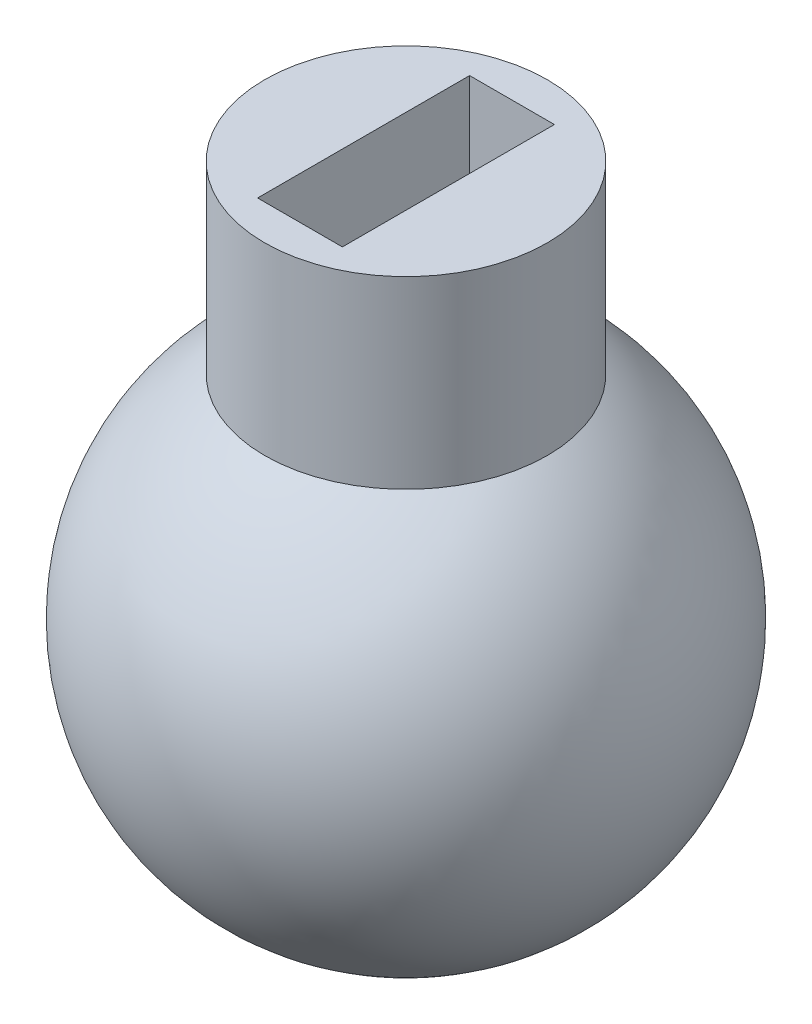
ISO-10303-21;
HEADER;
FILE_DESCRIPTION(('STEP AP214'),'2;1');
FILE_NAME('part.step','',(''),(''),'','','');
FILE_SCHEMA(('AUTOMOTIVE_DESIGN { 1 0 10303 214 1 1 1 1 }'));
ENDSEC;
DATA;
#1=APPLICATION_CONTEXT('core data for automotive mechanical design processes');
#2=APPLICATION_PROTOCOL_DEFINITION('international standard','automotive_design',2000,#1);
#3=PRODUCT_CONTEXT('',#1,'mechanical');
#4=PRODUCT('Part','Part','',(#3));
#5=PRODUCT_RELATED_PRODUCT_CATEGORY('part','',(#4));
#6=PRODUCT_DEFINITION_FORMATION('','',#4);
#7=PRODUCT_DEFINITION_CONTEXT('part definition',#1,'design');
#8=PRODUCT_DEFINITION('design','',#6,#7);
#9=PRODUCT_DEFINITION_SHAPE('','',#8);
#10=(LENGTH_UNIT() NAMED_UNIT(*) SI_UNIT(.MILLI.,.METRE.));
#11=(NAMED_UNIT(*) PLANE_ANGLE_UNIT() SI_UNIT($,.RADIAN.));
#12=(NAMED_UNIT(*) SI_UNIT($,.STERADIAN.) SOLID_ANGLE_UNIT());
#13=UNCERTAINTY_MEASURE_WITH_UNIT(LENGTH_MEASURE(1.E-05),#10,'distance_accuracy_value','');
#14=(GEOMETRIC_REPRESENTATION_CONTEXT(3) GLOBAL_UNCERTAINTY_ASSIGNED_CONTEXT((#13)) GLOBAL_UNIT_ASSIGNED_CONTEXT((#10,
#11,#12)) REPRESENTATION_CONTEXT('',''));
#15=CARTESIAN_POINT('',(0.,0.,0.));
#16=DIRECTION('',(0.,0.,1.));
#17=DIRECTION('',(1.,0.,0.));
#18=AXIS2_PLACEMENT_3D('',#15,#16,#17);
#19=CARTESIAN_POINT('',(-9.99999999999999,28.,0.));
#20=DIRECTION('',(0.,1.,0.));
#21=DIRECTION('',(0.,0.,1.));
#22=AXIS2_PLACEMENT_3D('',#19,#20,#21);
#23=PLANE('',#22);
#24=DIRECTION('',(0.,0.,-1.));
#25=VECTOR('',#24,1.);
#26=CARTESIAN_POINT('',(3.,28.,-7.5));
#27=LINE('',#26,#25);
#28=CARTESIAN_POINT('',(3.,28.,7.5));
#29=VERTEX_POINT('',#28);
#30=CARTESIAN_POINT('',(3.,28.,-7.5));
#31=VERTEX_POINT('',#30);
#32=EDGE_CURVE('E49',#29,#31,#27,.T.);
#33=ORIENTED_EDGE('',*,*,#32,.F.);
#34=DIRECTION('',(1.,0.,0.));
#35=VECTOR('',#34,1.);
#36=CARTESIAN_POINT('',(-3.,28.,7.5));
#37=LINE('',#36,#35);
#38=CARTESIAN_POINT('',(-3.,28.,7.5));
#39=VERTEX_POINT('',#38);
#40=EDGE_CURVE('E100',#39,#29,#37,.T.);
#41=ORIENTED_EDGE('',*,*,#40,.F.);
#42=DIRECTION('',(0.,0.,1.));
#43=VECTOR('',#42,1.);
#44=CARTESIAN_POINT('',(-3.,28.,-7.5));
#45=LINE('',#44,#43);
#46=CARTESIAN_POINT('',(-3.,28.,-7.5));
#47=VERTEX_POINT('',#46);
#48=EDGE_CURVE('E106',#47,#39,#45,.T.);
#49=ORIENTED_EDGE('',*,*,#48,.F.);
#50=DIRECTION('',(-1.,0.,0.));
#51=VECTOR('',#50,1.);
#52=CARTESIAN_POINT('',(-3.,28.,-7.5));
#53=LINE('',#52,#51);
#54=EDGE_CURVE('E84',#31,#47,#53,.T.);
#55=ORIENTED_EDGE('',*,*,#54,.F.);
#56=EDGE_LOOP('',(#33,#41,#49,#55));
#57=FACE_BOUND('',#56,.T.);
#58=CARTESIAN_POINT('',(0.,28.,0.));
#59=DIRECTION('',(0.,1.,0.));
#60=DIRECTION('',(0.,0.,1.));
#61=AXIS2_PLACEMENT_3D('',#58,#59,#60);
#62=CIRCLE('',#61,9.99999999999999);
#63=CARTESIAN_POINT('',(0.,28.,9.99999999999999));
#64=VERTEX_POINT('',#63);
#65=EDGE_CURVE('E11',#64,#64,#62,.T.);
#66=ORIENTED_EDGE('',*,*,#65,.T.);
#67=EDGE_LOOP('',(#66));
#68=FACE_BOUND('',#67,.T.);
#69=ADVANCED_FACE('F35',(#57,#68),#23,.T.);
#70=CARTESIAN_POINT('',(0.,81.2795464270371,0.));
#71=DIRECTION('',(0.,1.,0.));
#72=DIRECTION('',(0.,0.,1.));
#73=AXIS2_PLACEMENT_3D('',#70,#71,#72);
#74=CYLINDRICAL_SURFACE('',#73,9.99999999999999);
#75=CARTESIAN_POINT('',(0.,14.9666295470958,0.));
#76=DIRECTION('',(0.,1.,0.));
#77=DIRECTION('',(0.,0.,1.));
#78=AXIS2_PLACEMENT_3D('',#75,#76,#77);
#79=CIRCLE('',#78,9.99999999999999);
#80=CARTESIAN_POINT('',(0.,14.9666295470958,9.99999999999999));
#81=VERTEX_POINT('',#80);
#82=EDGE_CURVE('E42',#81,#81,#79,.T.);
#83=ORIENTED_EDGE('',*,*,#82,.T.);
#84=EDGE_LOOP('',(#83));
#85=FACE_BOUND('',#84,.T.);
#86=ORIENTED_EDGE('',*,*,#65,.F.);
#87=EDGE_LOOP('',(#86));
#88=FACE_BOUND('',#87,.T.);
#89=ADVANCED_FACE('F114',(#85,#88),#74,.T.);
#90=CARTESIAN_POINT('',(0.,0.,0.));
#91=DIRECTION('',(0.,1.,0.));
#92=DIRECTION('',(-1.,0.,0.));
#93=AXIS2_PLACEMENT_3D('',#90,#91,#92);
#94=SPHERICAL_SURFACE('',#93,18.);
#95=ORIENTED_EDGE('',*,*,#82,.F.);
#96=EDGE_LOOP('',(#95));
#97=FACE_BOUND('',#96,.T.);
#98=ADVANCED_FACE('F117',(#97),#94,.T.);
#99=CARTESIAN_POINT('',(3.,4.,-7.5));
#100=DIRECTION('',(1.,0.,0.));
#101=DIRECTION('',(0.,0.,-1.));
#102=AXIS2_PLACEMENT_3D('',#99,#100,#101);
#103=PLANE('',#102);
#104=ORIENTED_EDGE('',*,*,#32,.T.);
#105=DIRECTION('',(0.,1.,0.));
#106=VECTOR('',#105,1.);
#107=CARTESIAN_POINT('',(3.,4.,-7.5));
#108=LINE('',#107,#106);
#109=CARTESIAN_POINT('',(3.,4.,-7.5));
#110=VERTEX_POINT('',#109);
#111=EDGE_CURVE('E72',#110,#31,#108,.T.);
#112=ORIENTED_EDGE('',*,*,#111,.F.);
#113=DIRECTION('',(0.,0.,-1.));
#114=VECTOR('',#113,1.);
#115=CARTESIAN_POINT('',(3.,4.,-7.5));
#116=LINE('',#115,#114);
#117=CARTESIAN_POINT('',(3.,4.,7.5));
#118=VERTEX_POINT('',#117);
#119=EDGE_CURVE('E98',#118,#110,#116,.T.);
#120=ORIENTED_EDGE('',*,*,#119,.F.);
#121=DIRECTION('',(0.,1.,0.));
#122=VECTOR('',#121,1.);
#123=CARTESIAN_POINT('',(3.,4.,7.5));
#124=LINE('',#123,#122);
#125=EDGE_CURVE('E57',#118,#29,#124,.T.);
#126=ORIENTED_EDGE('',*,*,#125,.T.);
#127=EDGE_LOOP('',(#104,#112,#120,#126));
#128=FACE_BOUND('',#127,.T.);
#129=ADVANCED_FACE('F119',(#128),#103,.F.);
#130=CARTESIAN_POINT('',(-3.,4.,7.5));
#131=DIRECTION('',(0.,0.,1.));
#132=DIRECTION('',(1.,0.,0.));
#133=AXIS2_PLACEMENT_3D('',#130,#131,#132);
#134=PLANE('',#133);
#135=ORIENTED_EDGE('',*,*,#40,.T.);
#136=ORIENTED_EDGE('',*,*,#125,.F.);
#137=DIRECTION('',(1.,0.,0.));
#138=VECTOR('',#137,1.);
#139=CARTESIAN_POINT('',(-3.,4.,7.5));
#140=LINE('',#139,#138);
#141=CARTESIAN_POINT('',(-3.,4.,7.5));
#142=VERTEX_POINT('',#141);
#143=EDGE_CURVE('E95',#142,#118,#140,.T.);
#144=ORIENTED_EDGE('',*,*,#143,.F.);
#145=DIRECTION('',(0.,1.,0.));
#146=VECTOR('',#145,1.);
#147=CARTESIAN_POINT('',(-3.,4.,7.5));
#148=LINE('',#147,#146);
#149=EDGE_CURVE('E88',#142,#39,#148,.T.);
#150=ORIENTED_EDGE('',*,*,#149,.T.);
#151=EDGE_LOOP('',(#135,#136,#144,#150));
#152=FACE_BOUND('',#151,.T.);
#153=ADVANCED_FACE('F125',(#152),#134,.F.);
#154=CARTESIAN_POINT('',(-3.,4.,-7.5));
#155=DIRECTION('',(-1.,0.,0.));
#156=DIRECTION('',(0.,0.,1.));
#157=AXIS2_PLACEMENT_3D('',#154,#155,#156);
#158=PLANE('',#157);
#159=ORIENTED_EDGE('',*,*,#48,.T.);
#160=ORIENTED_EDGE('',*,*,#149,.F.);
#161=DIRECTION('',(0.,0.,1.));
#162=VECTOR('',#161,1.);
#163=CARTESIAN_POINT('',(-3.,4.,-7.5));
#164=LINE('',#163,#162);
#165=CARTESIAN_POINT('',(-3.,4.,-7.5));
#166=VERTEX_POINT('',#165);
#167=EDGE_CURVE('E91',#166,#142,#164,.T.);
#168=ORIENTED_EDGE('',*,*,#167,.F.);
#169=DIRECTION('',(0.,1.,0.));
#170=VECTOR('',#169,1.);
#171=CARTESIAN_POINT('',(-3.,4.,-7.5));
#172=LINE('',#171,#170);
#173=EDGE_CURVE('E77',#166,#47,#172,.T.);
#174=ORIENTED_EDGE('',*,*,#173,.T.);
#175=EDGE_LOOP('',(#159,#160,#168,#174));
#176=FACE_BOUND('',#175,.T.);
#177=ADVANCED_FACE('F92',(#176),#158,.F.);
#178=CARTESIAN_POINT('',(-3.,4.,-7.5));
#179=DIRECTION('',(0.,0.,-1.));
#180=DIRECTION('',(-1.,0.,0.));
#181=AXIS2_PLACEMENT_3D('',#178,#179,#180);
#182=PLANE('',#181);
#183=ORIENTED_EDGE('',*,*,#54,.T.);
#184=ORIENTED_EDGE('',*,*,#173,.F.);
#185=DIRECTION('',(-1.,0.,0.));
#186=VECTOR('',#185,1.);
#187=CARTESIAN_POINT('',(-3.,4.,-7.5));
#188=LINE('',#187,#186);
#189=EDGE_CURVE('E81',#110,#166,#188,.T.);
#190=ORIENTED_EDGE('',*,*,#189,.F.);
#191=ORIENTED_EDGE('',*,*,#111,.T.);
#192=EDGE_LOOP('',(#183,#184,#190,#191));
#193=FACE_BOUND('',#192,.T.);
#194=ADVANCED_FACE('F79',(#193),#182,.F.);
#195=CARTESIAN_POINT('',(0.,4.,0.));
#196=DIRECTION('',(0.,1.,0.));
#197=DIRECTION('',(0.,0.,1.));
#198=AXIS2_PLACEMENT_3D('',#195,#196,#197);
#199=PLANE('',#198);
#200=ORIENTED_EDGE('',*,*,#119,.T.);
#201=ORIENTED_EDGE('',*,*,#189,.T.);
#202=ORIENTED_EDGE('',*,*,#167,.T.);
#203=ORIENTED_EDGE('',*,*,#143,.T.);
#204=EDGE_LOOP('',(#200,#201,#202,#203));
#205=FACE_BOUND('',#204,.T.);
#206=ADVANCED_FACE('F97',(#205),#199,.T.);
#207=CLOSED_SHELL('',(#69,#89,#98,#129,#153,#177,#194,#206));
#208=MANIFOLD_SOLID_BREP('B2',#207);
#209=ADVANCED_BREP_SHAPE_REPRESENTATION('',(#18,#208),#14);
#210=SHAPE_DEFINITION_REPRESENTATION(#9,#209);
ENDSEC;
END-ISO-10303-21;
